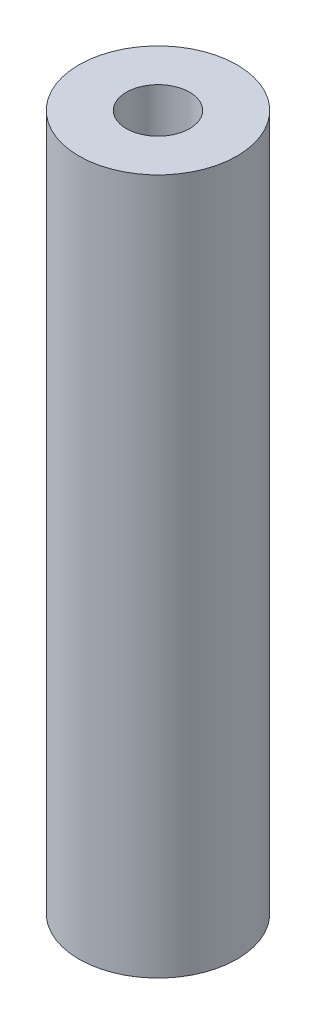
ISO-10303-21;
HEADER;
FILE_DESCRIPTION(('STEP AP214'),'2;1');
FILE_NAME('part.step','',(''),(''),'','','');
FILE_SCHEMA(('AUTOMOTIVE_DESIGN { 1 0 10303 214 1 1 1 1 }'));
ENDSEC;
DATA;
#1=APPLICATION_CONTEXT('core data for automotive mechanical design processes');
#2=APPLICATION_PROTOCOL_DEFINITION('international standard','automotive_design',2000,#1);
#3=PRODUCT_CONTEXT('',#1,'mechanical');
#4=PRODUCT('Part','Part','',(#3));
#5=PRODUCT_RELATED_PRODUCT_CATEGORY('part','',(#4));
#6=PRODUCT_DEFINITION_FORMATION('','',#4);
#7=PRODUCT_DEFINITION_CONTEXT('part definition',#1,'design');
#8=PRODUCT_DEFINITION('design','',#6,#7);
#9=PRODUCT_DEFINITION_SHAPE('','',#8);
#10=(LENGTH_UNIT() NAMED_UNIT(*) SI_UNIT(.MILLI.,.METRE.));
#11=(NAMED_UNIT(*) PLANE_ANGLE_UNIT() SI_UNIT($,.RADIAN.));
#12=(NAMED_UNIT(*) SI_UNIT($,.STERADIAN.) SOLID_ANGLE_UNIT());
#13=UNCERTAINTY_MEASURE_WITH_UNIT(LENGTH_MEASURE(1.E-05),#10,'distance_accuracy_value','');
#14=(GEOMETRIC_REPRESENTATION_CONTEXT(3) GLOBAL_UNCERTAINTY_ASSIGNED_CONTEXT((#13)) GLOBAL_UNIT_ASSIGNED_CONTEXT((#10,
#11,#12)) REPRESENTATION_CONTEXT('',''));
#15=CARTESIAN_POINT('',(0.,0.,0.));
#16=DIRECTION('',(0.,0.,1.));
#17=DIRECTION('',(1.,0.,0.));
#18=AXIS2_PLACEMENT_3D('',#15,#16,#17);
#19=CARTESIAN_POINT('',(0.,22.,0.));
#20=DIRECTION('',(0.,1.,0.));
#21=DIRECTION('',(0.,0.,1.));
#22=AXIS2_PLACEMENT_3D('',#19,#20,#21);
#23=PLANE('',#22);
#24=CARTESIAN_POINT('',(0.,22.,0.));
#25=DIRECTION('',(0.,1.,0.));
#26=DIRECTION('',(0.,0.,1.));
#27=AXIS2_PLACEMENT_3D('',#24,#25,#26);
#28=CIRCLE('',#27,2.5);
#29=CARTESIAN_POINT('',(0.,22.,2.5));
#30=VERTEX_POINT('',#29);
#31=EDGE_CURVE('E10',#30,#30,#28,.T.);
#32=ORIENTED_EDGE('',*,*,#31,.T.);
#33=EDGE_LOOP('',(#32));
#34=FACE_BOUND('',#33,.T.);
#35=CARTESIAN_POINT('',(0.,22.,0.));
#36=DIRECTION('',(0.,1.,0.));
#37=DIRECTION('',(0.,0.,1.));
#38=AXIS2_PLACEMENT_3D('',#35,#36,#37);
#39=CIRCLE('',#38,1.);
#40=CARTESIAN_POINT('',(0.,22.,1.));
#41=VERTEX_POINT('',#40);
#42=EDGE_CURVE('E42',#41,#41,#39,.T.);
#43=ORIENTED_EDGE('',*,*,#42,.F.);
#44=EDGE_LOOP('',(#43));
#45=FACE_BOUND('',#44,.T.);
#46=ADVANCED_FACE('F31',(#34,#45),#23,.T.);
#47=CARTESIAN_POINT('',(0.,0.,0.));
#48=DIRECTION('',(0.,1.,0.));
#49=DIRECTION('',(0.,0.,1.));
#50=AXIS2_PLACEMENT_3D('',#47,#48,#49);
#51=PLANE('',#50);
#52=CARTESIAN_POINT('',(0.,0.,0.));
#53=DIRECTION('',(0.,1.,0.));
#54=DIRECTION('',(0.,0.,1.));
#55=AXIS2_PLACEMENT_3D('',#52,#53,#54);
#56=CIRCLE('',#55,2.5);
#57=CARTESIAN_POINT('',(0.,0.,2.5));
#58=VERTEX_POINT('',#57);
#59=EDGE_CURVE('E35',#58,#58,#56,.T.);
#60=ORIENTED_EDGE('',*,*,#59,.F.);
#61=EDGE_LOOP('',(#60));
#62=FACE_BOUND('',#61,.T.);
#63=CARTESIAN_POINT('',(0.,0.,0.));
#64=DIRECTION('',(0.,1.,0.));
#65=DIRECTION('',(0.,0.,1.));
#66=AXIS2_PLACEMENT_3D('',#63,#64,#65);
#67=CIRCLE('',#66,1.);
#68=CARTESIAN_POINT('',(0.,0.,1.));
#69=VERTEX_POINT('',#68);
#70=EDGE_CURVE('E44',#69,#69,#67,.T.);
#71=ORIENTED_EDGE('',*,*,#70,.T.);
#72=EDGE_LOOP('',(#71));
#73=FACE_BOUND('',#72,.T.);
#74=ADVANCED_FACE('F54',(#62,#73),#51,.F.);
#75=CARTESIAN_POINT('',(0.,22.,0.));
#76=DIRECTION('',(0.,-1.,0.));
#77=DIRECTION('',(0.,0.,-1.));
#78=AXIS2_PLACEMENT_3D('',#75,#76,#77);
#79=CYLINDRICAL_SURFACE('',#78,2.5);
#80=ORIENTED_EDGE('',*,*,#31,.F.);
#81=EDGE_LOOP('',(#80));
#82=FACE_BOUND('',#81,.T.);
#83=ORIENTED_EDGE('',*,*,#59,.T.);
#84=EDGE_LOOP('',(#83));
#85=FACE_BOUND('',#84,.T.);
#86=ADVANCED_FACE('F33',(#82,#85),#79,.T.);
#87=CARTESIAN_POINT('',(0.,22.,0.));
#88=DIRECTION('',(0.,-1.,0.));
#89=DIRECTION('',(0.,0.,-1.));
#90=AXIS2_PLACEMENT_3D('',#87,#88,#89);
#91=CYLINDRICAL_SURFACE('',#90,1.);
#92=ORIENTED_EDGE('',*,*,#42,.T.);
#93=EDGE_LOOP('',(#92));
#94=FACE_BOUND('',#93,.T.);
#95=ORIENTED_EDGE('',*,*,#70,.F.);
#96=EDGE_LOOP('',(#95));
#97=FACE_BOUND('',#96,.T.);
#98=ADVANCED_FACE('F50',(#94,#97),#91,.F.);
#99=CLOSED_SHELL('',(#46,#74,#86,#98));
#100=MANIFOLD_SOLID_BREP('B2',#99);
#101=ADVANCED_BREP_SHAPE_REPRESENTATION('',(#18,#100),#14);
#102=SHAPE_DEFINITION_REPRESENTATION(#9,#101);
ENDSEC;
END-ISO-10303-21;
